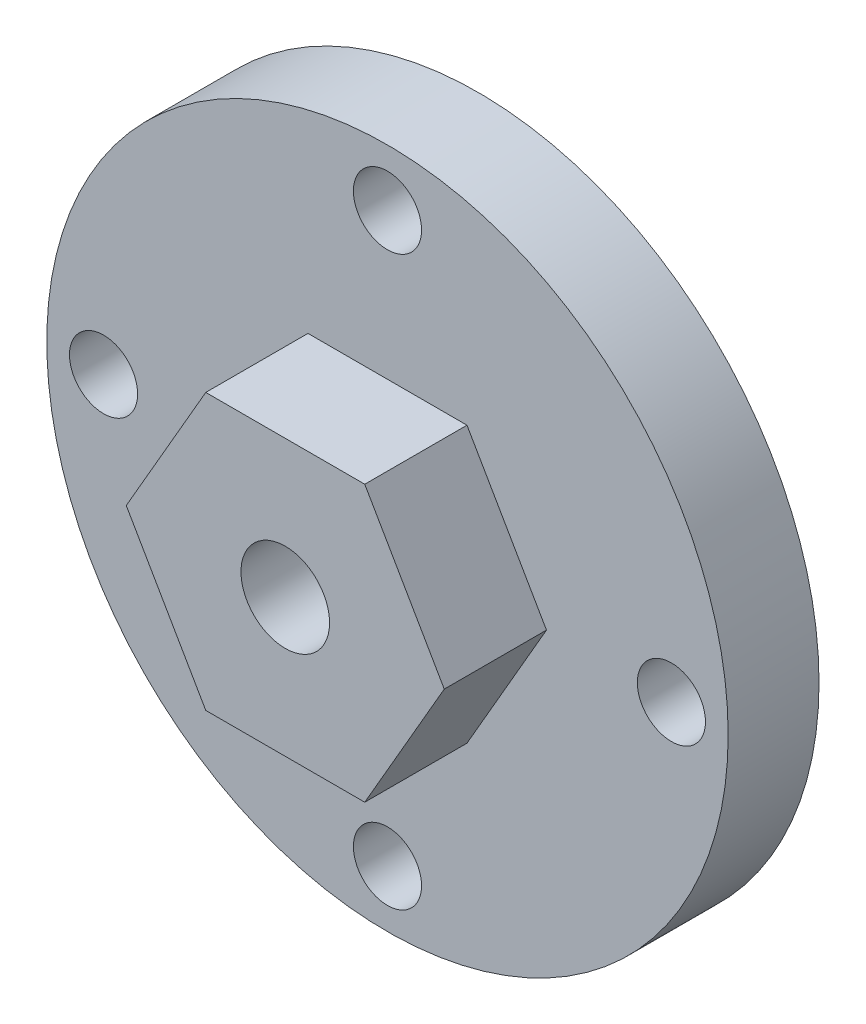
ISO-10303-21;
HEADER;
FILE_DESCRIPTION(('STEP AP214'),'2;1');
FILE_NAME('part.step','',(''),(''),'','','');
FILE_SCHEMA(('AUTOMOTIVE_DESIGN { 1 0 10303 214 1 1 1 1 }'));
ENDSEC;
DATA;
#1=APPLICATION_CONTEXT('core data for automotive mechanical design processes');
#2=APPLICATION_PROTOCOL_DEFINITION('international standard','automotive_design',2000,#1);
#3=PRODUCT_CONTEXT('',#1,'mechanical');
#4=PRODUCT('Part','Part','',(#3));
#5=PRODUCT_RELATED_PRODUCT_CATEGORY('part','',(#4));
#6=PRODUCT_DEFINITION_FORMATION('','',#4);
#7=PRODUCT_DEFINITION_CONTEXT('part definition',#1,'design');
#8=PRODUCT_DEFINITION('design','',#6,#7);
#9=PRODUCT_DEFINITION_SHAPE('','',#8);
#10=(LENGTH_UNIT() NAMED_UNIT(*) SI_UNIT(.MILLI.,.METRE.));
#11=(NAMED_UNIT(*) PLANE_ANGLE_UNIT() SI_UNIT($,.RADIAN.));
#12=(NAMED_UNIT(*) SI_UNIT($,.STERADIAN.) SOLID_ANGLE_UNIT());
#13=UNCERTAINTY_MEASURE_WITH_UNIT(LENGTH_MEASURE(1.E-05),#10,'distance_accuracy_value','');
#14=(GEOMETRIC_REPRESENTATION_CONTEXT(3) GLOBAL_UNCERTAINTY_ASSIGNED_CONTEXT((#13)) GLOBAL_UNIT_ASSIGNED_CONTEXT((#10,
#11,#12)) REPRESENTATION_CONTEXT('',''));
#15=CARTESIAN_POINT('',(0.,0.,0.));
#16=DIRECTION('',(0.,0.,1.));
#17=DIRECTION('',(1.,0.,0.));
#18=AXIS2_PLACEMENT_3D('',#15,#16,#17);
#19=CARTESIAN_POINT('',(0.,0.,4.));
#20=DIRECTION('',(0.,0.,-1.));
#21=DIRECTION('',(-1.,0.,0.));
#22=AXIS2_PLACEMENT_3D('',#19,#20,#21);
#23=CYLINDRICAL_SURFACE('',#22,15.);
#24=CARTESIAN_POINT('',(0.,0.,4.));
#25=DIRECTION('',(0.,0.,1.));
#26=DIRECTION('',(1.,0.,0.));
#27=AXIS2_PLACEMENT_3D('',#24,#25,#26);
#28=CIRCLE('',#27,15.);
#29=CARTESIAN_POINT('',(15.,0.,4.));
#30=VERTEX_POINT('',#29);
#31=EDGE_CURVE('E11',#30,#30,#28,.T.);
#32=ORIENTED_EDGE('',*,*,#31,.F.);
#33=EDGE_LOOP('',(#32));
#34=FACE_BOUND('',#33,.T.);
#35=CARTESIAN_POINT('',(0.,0.,0.));
#36=DIRECTION('',(0.,0.,1.));
#37=DIRECTION('',(1.,0.,0.));
#38=AXIS2_PLACEMENT_3D('',#35,#36,#37);
#39=CIRCLE('',#38,15.);
#40=CARTESIAN_POINT('',(15.,0.,0.));
#41=VERTEX_POINT('',#40);
#42=EDGE_CURVE('E37',#41,#41,#39,.T.);
#43=ORIENTED_EDGE('',*,*,#42,.T.);
#44=EDGE_LOOP('',(#43));
#45=FACE_BOUND('',#44,.T.);
#46=ADVANCED_FACE('F34',(#34,#45),#23,.T.);
#47=CARTESIAN_POINT('',(0.,0.,4.));
#48=DIRECTION('',(0.,0.,1.));
#49=DIRECTION('',(1.,0.,0.));
#50=AXIS2_PLACEMENT_3D('',#47,#48,#49);
#51=PLANE('',#50);
#52=CARTESIAN_POINT('',(0.,12.5,4.));
#53=DIRECTION('',(0.,0.,1.));
#54=DIRECTION('',(1.,0.,0.));
#55=AXIS2_PLACEMENT_3D('',#52,#53,#54);
#56=CIRCLE('',#55,1.5);
#57=CARTESIAN_POINT('',(1.5,12.5,4.));
#58=VERTEX_POINT('',#57);
#59=EDGE_CURVE('E143',#58,#58,#56,.T.);
#60=ORIENTED_EDGE('',*,*,#59,.F.);
#61=EDGE_LOOP('',(#60));
#62=FACE_BOUND('',#61,.T.);
#63=CARTESIAN_POINT('',(-12.5,0.,4.));
#64=DIRECTION('',(0.,0.,1.));
#65=DIRECTION('',(1.,0.,0.));
#66=AXIS2_PLACEMENT_3D('',#63,#64,#65);
#67=CIRCLE('',#66,1.5);
#68=CARTESIAN_POINT('',(-11.,0.,4.));
#69=VERTEX_POINT('',#68);
#70=EDGE_CURVE('E148',#69,#69,#67,.T.);
#71=ORIENTED_EDGE('',*,*,#70,.F.);
#72=EDGE_LOOP('',(#71));
#73=FACE_BOUND('',#72,.T.);
#74=CARTESIAN_POINT('',(-3.50678942383248E-13,-12.5,4.));
#75=DIRECTION('',(0.,0.,1.));
#76=DIRECTION('',(1.,0.,0.));
#77=AXIS2_PLACEMENT_3D('',#74,#75,#76);
#78=CIRCLE('',#77,1.50000000000042);
#79=CARTESIAN_POINT('',(1.50000000000007,-12.5,4.));
#80=VERTEX_POINT('',#79);
#81=EDGE_CURVE('E151',#80,#80,#78,.T.);
#82=ORIENTED_EDGE('',*,*,#81,.F.);
#83=EDGE_LOOP('',(#82));
#84=FACE_BOUND('',#83,.T.);
#85=CARTESIAN_POINT('',(12.4999999999998,-1.76870279690558E-13,4.));
#86=DIRECTION('',(0.,0.,1.));
#87=DIRECTION('',(1.,0.,0.));
#88=AXIS2_PLACEMENT_3D('',#85,#86,#87);
#89=CIRCLE('',#88,1.50000000000034);
#90=CARTESIAN_POINT('',(14.0000000000002,-1.76870279690558E-13,4.));
#91=VERTEX_POINT('',#90);
#92=EDGE_CURVE('E154',#91,#91,#89,.T.);
#93=ORIENTED_EDGE('',*,*,#92,.F.);
#94=EDGE_LOOP('',(#93));
#95=FACE_BOUND('',#94,.T.);
#96=DIRECTION('',(-0.500000000000001,0.866025403784438,0.));
#97=VECTOR('',#96,1.);
#98=CARTESIAN_POINT('',(7.00000000000001,0.,4.));
#99=LINE('',#98,#97);
#100=CARTESIAN_POINT('',(7.00000000000001,0.,4.));
#101=VERTEX_POINT('',#100);
#102=CARTESIAN_POINT('',(3.5,6.06217782649108,4.));
#103=VERTEX_POINT('',#102);
#104=EDGE_CURVE('E48',#101,#103,#99,.T.);
#105=ORIENTED_EDGE('',*,*,#104,.F.);
#106=DIRECTION('',(0.5,0.866025403784439,0.));
#107=VECTOR('',#106,1.);
#108=CARTESIAN_POINT('',(3.50000000000001,-6.06217782649107,4.));
#109=LINE('',#108,#107);
#110=CARTESIAN_POINT('',(3.50000000000001,-6.06217782649107,4.));
#111=VERTEX_POINT('',#110);
#112=EDGE_CURVE('E52',#111,#101,#109,.T.);
#113=ORIENTED_EDGE('',*,*,#112,.F.);
#114=DIRECTION('',(1.,0.,0.));
#115=VECTOR('',#114,1.);
#116=CARTESIAN_POINT('',(-3.5,-6.06217782649108,4.));
#117=LINE('',#116,#115);
#118=CARTESIAN_POINT('',(-3.5,-6.06217782649108,4.));
#119=VERTEX_POINT('',#118);
#120=EDGE_CURVE('E122',#119,#111,#117,.T.);
#121=ORIENTED_EDGE('',*,*,#120,.F.);
#122=DIRECTION('',(0.5,-0.866025403784439,0.));
#123=VECTOR('',#122,1.);
#124=CARTESIAN_POINT('',(-7.,0.,4.));
#125=LINE('',#124,#123);
#126=CARTESIAN_POINT('',(-7.,0.,4.));
#127=VERTEX_POINT('',#126);
#128=EDGE_CURVE('E124',#127,#119,#125,.T.);
#129=ORIENTED_EDGE('',*,*,#128,.F.);
#130=DIRECTION('',(-0.5,-0.866025403784439,0.));
#131=VECTOR('',#130,1.);
#132=CARTESIAN_POINT('',(-3.5,6.06217782649108,4.));
#133=LINE('',#132,#131);
#134=CARTESIAN_POINT('',(-3.5,6.06217782649108,4.));
#135=VERTEX_POINT('',#134);
#136=EDGE_CURVE('E127',#135,#127,#133,.T.);
#137=ORIENTED_EDGE('',*,*,#136,.F.);
#138=DIRECTION('',(-1.,0.,0.));
#139=VECTOR('',#138,1.);
#140=CARTESIAN_POINT('',(3.5,6.06217782649108,4.));
#141=LINE('',#140,#139);
#142=EDGE_CURVE('E130',#103,#135,#141,.T.);
#143=ORIENTED_EDGE('',*,*,#142,.F.);
#144=EDGE_LOOP('',(#105,#113,#121,#129,#137,#143));
#145=FACE_BOUND('',#144,.T.);
#146=ORIENTED_EDGE('',*,*,#31,.T.);
#147=EDGE_LOOP('',(#146));
#148=FACE_BOUND('',#147,.T.);
#149=ADVANCED_FACE('F175',(#62,#73,#84,#95,#145,#148),#51,.T.);
#150=CARTESIAN_POINT('',(0.,0.,0.));
#151=DIRECTION('',(0.,0.,1.));
#152=DIRECTION('',(1.,0.,0.));
#153=AXIS2_PLACEMENT_3D('',#150,#151,#152);
#154=PLANE('',#153);
#155=CARTESIAN_POINT('',(0.,12.5,0.));
#156=DIRECTION('',(0.,0.,-1.));
#157=DIRECTION('',(-1.,0.,0.));
#158=AXIS2_PLACEMENT_3D('',#155,#156,#157);
#159=CIRCLE('',#158,1.5);
#160=CARTESIAN_POINT('',(-1.5,12.5,0.));
#161=VERTEX_POINT('',#160);
#162=EDGE_CURVE('E157',#161,#161,#159,.T.);
#163=ORIENTED_EDGE('',*,*,#162,.F.);
#164=EDGE_LOOP('',(#163));
#165=FACE_BOUND('',#164,.T.);
#166=CARTESIAN_POINT('',(-12.5,0.,0.));
#167=DIRECTION('',(0.,0.,-1.));
#168=DIRECTION('',(-1.,0.,0.));
#169=AXIS2_PLACEMENT_3D('',#166,#167,#168);
#170=CIRCLE('',#169,1.5);
#171=CARTESIAN_POINT('',(-14.,0.,0.));
#172=VERTEX_POINT('',#171);
#173=EDGE_CURVE('E164',#172,#172,#170,.T.);
#174=ORIENTED_EDGE('',*,*,#173,.F.);
#175=EDGE_LOOP('',(#174));
#176=FACE_BOUND('',#175,.T.);
#177=CARTESIAN_POINT('',(-3.50678942383248E-13,-12.5,0.));
#178=DIRECTION('',(0.,0.,-1.));
#179=DIRECTION('',(-1.,0.,0.));
#180=AXIS2_PLACEMENT_3D('',#177,#178,#179);
#181=CIRCLE('',#180,1.50000000000042);
#182=CARTESIAN_POINT('',(-1.50000000000077,-12.5,0.));
#183=VERTEX_POINT('',#182);
#184=EDGE_CURVE('E161',#183,#183,#181,.T.);
#185=ORIENTED_EDGE('',*,*,#184,.F.);
#186=EDGE_LOOP('',(#185));
#187=FACE_BOUND('',#186,.T.);
#188=CARTESIAN_POINT('',(12.4999999999998,-1.76870279690558E-13,0.));
#189=DIRECTION('',(0.,0.,-1.));
#190=DIRECTION('',(-1.,0.,0.));
#191=AXIS2_PLACEMENT_3D('',#188,#189,#190);
#192=CIRCLE('',#191,1.50000000000034);
#193=CARTESIAN_POINT('',(10.9999999999995,-1.76870279690558E-13,0.));
#194=VERTEX_POINT('',#193);
#195=EDGE_CURVE('E158',#194,#194,#192,.T.);
#196=ORIENTED_EDGE('',*,*,#195,.F.);
#197=EDGE_LOOP('',(#196));
#198=FACE_BOUND('',#197,.T.);
#199=CARTESIAN_POINT('',(0.,0.,0.));
#200=DIRECTION('',(0.,0.,1.));
#201=DIRECTION('',(1.,0.,0.));
#202=AXIS2_PLACEMENT_3D('',#199,#200,#201);
#203=CIRCLE('',#202,1.95);
#204=CARTESIAN_POINT('',(1.95,0.,0.));
#205=VERTEX_POINT('',#204);
#206=EDGE_CURVE('E133',#205,#205,#203,.T.);
#207=ORIENTED_EDGE('',*,*,#206,.T.);
#208=EDGE_LOOP('',(#207));
#209=FACE_BOUND('',#208,.T.);
#210=ORIENTED_EDGE('',*,*,#42,.F.);
#211=EDGE_LOOP('',(#210));
#212=FACE_BOUND('',#211,.T.);
#213=ADVANCED_FACE('F172',(#165,#176,#187,#198,#209,#212),#154,.F.);
#214=CARTESIAN_POINT('',(7.00000000000001,0.,8.5));
#215=DIRECTION('',(-0.866025403784438,-0.500000000000001,0.));
#216=DIRECTION('',(0.500000000000001,-0.866025403784438,0.));
#217=AXIS2_PLACEMENT_3D('',#214,#215,#216);
#218=PLANE('',#217);
#219=ORIENTED_EDGE('',*,*,#104,.T.);
#220=DIRECTION('',(0.,0.,-1.));
#221=VECTOR('',#220,1.);
#222=CARTESIAN_POINT('',(3.5,6.06217782649108,8.5));
#223=LINE('',#222,#221);
#224=CARTESIAN_POINT('',(3.5,6.06217782649108,8.5));
#225=VERTEX_POINT('',#224);
#226=EDGE_CURVE('E89',#225,#103,#223,.T.);
#227=ORIENTED_EDGE('',*,*,#226,.F.);
#228=DIRECTION('',(-0.500000000000001,0.866025403784438,0.));
#229=VECTOR('',#228,1.);
#230=CARTESIAN_POINT('',(7.00000000000001,0.,8.5));
#231=LINE('',#230,#229);
#232=CARTESIAN_POINT('',(7.00000000000001,0.,8.5));
#233=VERTEX_POINT('',#232);
#234=EDGE_CURVE('E95',#233,#225,#231,.T.);
#235=ORIENTED_EDGE('',*,*,#234,.F.);
#236=DIRECTION('',(0.,0.,-1.));
#237=VECTOR('',#236,1.);
#238=CARTESIAN_POINT('',(7.00000000000001,0.,8.5));
#239=LINE('',#238,#237);
#240=EDGE_CURVE('E119',#233,#101,#239,.T.);
#241=ORIENTED_EDGE('',*,*,#240,.T.);
#242=EDGE_LOOP('',(#219,#227,#235,#241));
#243=FACE_BOUND('',#242,.T.);
#244=ADVANCED_FACE('F105',(#243),#218,.F.);
#245=CARTESIAN_POINT('',(3.5,6.06217782649108,8.5));
#246=DIRECTION('',(0.,-1.,0.));
#247=DIRECTION('',(0.,0.,-1.));
#248=AXIS2_PLACEMENT_3D('',#245,#246,#247);
#249=PLANE('',#248);
#250=ORIENTED_EDGE('',*,*,#142,.T.);
#251=DIRECTION('',(0.,0.,-1.));
#252=VECTOR('',#251,1.);
#253=CARTESIAN_POINT('',(-3.5,6.06217782649108,8.5));
#254=LINE('',#253,#252);
#255=CARTESIAN_POINT('',(-3.5,6.06217782649108,8.5));
#256=VERTEX_POINT('',#255);
#257=EDGE_CURVE('E91',#256,#135,#254,.T.);
#258=ORIENTED_EDGE('',*,*,#257,.F.);
#259=DIRECTION('',(-1.,0.,0.));
#260=VECTOR('',#259,1.);
#261=CARTESIAN_POINT('',(3.5,6.06217782649108,8.5));
#262=LINE('',#261,#260);
#263=EDGE_CURVE('E84',#225,#256,#262,.T.);
#264=ORIENTED_EDGE('',*,*,#263,.F.);
#265=ORIENTED_EDGE('',*,*,#226,.T.);
#266=EDGE_LOOP('',(#250,#258,#264,#265));
#267=FACE_BOUND('',#266,.T.);
#268=ADVANCED_FACE('F87',(#267),#249,.F.);
#269=CARTESIAN_POINT('',(-3.5,6.06217782649108,8.5));
#270=DIRECTION('',(0.866025403784438,-0.5,0.));
#271=DIRECTION('',(0.5,0.866025403784439,0.));
#272=AXIS2_PLACEMENT_3D('',#269,#270,#271);
#273=PLANE('',#272);
#274=ORIENTED_EDGE('',*,*,#136,.T.);
#275=DIRECTION('',(0.,0.,-1.));
#276=VECTOR('',#275,1.);
#277=CARTESIAN_POINT('',(-7.,0.,8.5));
#278=LINE('',#277,#276);
#279=CARTESIAN_POINT('',(-7.,0.,8.5));
#280=VERTEX_POINT('',#279);
#281=EDGE_CURVE('E108',#280,#127,#278,.T.);
#282=ORIENTED_EDGE('',*,*,#281,.F.);
#283=DIRECTION('',(-0.5,-0.866025403784439,0.));
#284=VECTOR('',#283,1.);
#285=CARTESIAN_POINT('',(-3.5,6.06217782649108,8.5));
#286=LINE('',#285,#284);
#287=EDGE_CURVE('E94',#256,#280,#286,.T.);
#288=ORIENTED_EDGE('',*,*,#287,.F.);
#289=ORIENTED_EDGE('',*,*,#257,.T.);
#290=EDGE_LOOP('',(#274,#282,#288,#289));
#291=FACE_BOUND('',#290,.T.);
#292=ADVANCED_FACE('F204',(#291),#273,.F.);
#293=CARTESIAN_POINT('',(-7.,0.,8.5));
#294=DIRECTION('',(0.866025403784439,0.5,0.));
#295=DIRECTION('',(-0.5,0.866025403784439,0.));
#296=AXIS2_PLACEMENT_3D('',#293,#294,#295);
#297=PLANE('',#296);
#298=ORIENTED_EDGE('',*,*,#128,.T.);
#299=DIRECTION('',(0.,0.,-1.));
#300=VECTOR('',#299,1.);
#301=CARTESIAN_POINT('',(-3.5,-6.06217782649108,8.5));
#302=LINE('',#301,#300);
#303=CARTESIAN_POINT('',(-3.5,-6.06217782649108,8.5));
#304=VERTEX_POINT('',#303);
#305=EDGE_CURVE('E113',#304,#119,#302,.T.);
#306=ORIENTED_EDGE('',*,*,#305,.F.);
#307=DIRECTION('',(0.5,-0.866025403784439,0.));
#308=VECTOR('',#307,1.);
#309=CARTESIAN_POINT('',(-7.,0.,8.5));
#310=LINE('',#309,#308);
#311=EDGE_CURVE('E137',#280,#304,#310,.T.);
#312=ORIENTED_EDGE('',*,*,#311,.F.);
#313=ORIENTED_EDGE('',*,*,#281,.T.);
#314=EDGE_LOOP('',(#298,#306,#312,#313));
#315=FACE_BOUND('',#314,.T.);
#316=ADVANCED_FACE('F207',(#315),#297,.F.);
#317=CARTESIAN_POINT('',(-3.5,-6.06217782649108,8.5));
#318=DIRECTION('',(0.,1.,0.));
#319=DIRECTION('',(-1.,0.,0.));
#320=AXIS2_PLACEMENT_3D('',#317,#318,#319);
#321=PLANE('',#320);
#322=ORIENTED_EDGE('',*,*,#120,.T.);
#323=DIRECTION('',(0.,0.,-1.));
#324=VECTOR('',#323,1.);
#325=CARTESIAN_POINT('',(3.50000000000001,-6.06217782649107,8.5));
#326=LINE('',#325,#324);
#327=CARTESIAN_POINT('',(3.50000000000001,-6.06217782649107,8.5));
#328=VERTEX_POINT('',#327);
#329=EDGE_CURVE('E116',#328,#111,#326,.T.);
#330=ORIENTED_EDGE('',*,*,#329,.F.);
#331=DIRECTION('',(1.,0.,0.));
#332=VECTOR('',#331,1.);
#333=CARTESIAN_POINT('',(-3.5,-6.06217782649108,8.5));
#334=LINE('',#333,#332);
#335=EDGE_CURVE('E135',#304,#328,#334,.T.);
#336=ORIENTED_EDGE('',*,*,#335,.F.);
#337=ORIENTED_EDGE('',*,*,#305,.T.);
#338=EDGE_LOOP('',(#322,#330,#336,#337));
#339=FACE_BOUND('',#338,.T.);
#340=ADVANCED_FACE('F211',(#339),#321,.F.);
#341=CARTESIAN_POINT('',(3.50000000000001,-6.06217782649107,8.5));
#342=DIRECTION('',(-0.866025403784439,0.5,0.));
#343=DIRECTION('',(-0.5,-0.866025403784439,0.));
#344=AXIS2_PLACEMENT_3D('',#341,#342,#343);
#345=PLANE('',#344);
#346=ORIENTED_EDGE('',*,*,#112,.T.);
#347=ORIENTED_EDGE('',*,*,#240,.F.);
#348=DIRECTION('',(0.5,0.866025403784439,0.));
#349=VECTOR('',#348,1.);
#350=CARTESIAN_POINT('',(3.50000000000001,-6.06217782649107,8.5));
#351=LINE('',#350,#349);
#352=EDGE_CURVE('E100',#328,#233,#351,.T.);
#353=ORIENTED_EDGE('',*,*,#352,.F.);
#354=ORIENTED_EDGE('',*,*,#329,.T.);
#355=EDGE_LOOP('',(#346,#347,#353,#354));
#356=FACE_BOUND('',#355,.T.);
#357=ADVANCED_FACE('F215',(#356),#345,.F.);
#358=CARTESIAN_POINT('',(0.,0.,8.5));
#359=DIRECTION('',(0.,0.,1.));
#360=DIRECTION('',(1.,0.,0.));
#361=AXIS2_PLACEMENT_3D('',#358,#359,#360);
#362=PLANE('',#361);
#363=CARTESIAN_POINT('',(0.,0.,8.5));
#364=DIRECTION('',(0.,0.,1.));
#365=DIRECTION('',(1.,0.,0.));
#366=AXIS2_PLACEMENT_3D('',#363,#364,#365);
#367=CIRCLE('',#366,1.95);
#368=CARTESIAN_POINT('',(1.95,0.,8.5));
#369=VERTEX_POINT('',#368);
#370=EDGE_CURVE('E140',#369,#369,#367,.T.);
#371=ORIENTED_EDGE('',*,*,#370,.F.);
#372=EDGE_LOOP('',(#371));
#373=FACE_BOUND('',#372,.T.);
#374=ORIENTED_EDGE('',*,*,#234,.T.);
#375=ORIENTED_EDGE('',*,*,#263,.T.);
#376=ORIENTED_EDGE('',*,*,#287,.T.);
#377=ORIENTED_EDGE('',*,*,#311,.T.);
#378=ORIENTED_EDGE('',*,*,#335,.T.);
#379=ORIENTED_EDGE('',*,*,#352,.T.);
#380=EDGE_LOOP('',(#374,#375,#376,#377,#378,#379));
#381=FACE_BOUND('',#380,.T.);
#382=ADVANCED_FACE('F98',(#373,#381),#362,.T.);
#383=CARTESIAN_POINT('',(0.,0.,0.));
#384=DIRECTION('',(0.,0.,1.));
#385=DIRECTION('',(1.,0.,0.));
#386=AXIS2_PLACEMENT_3D('',#383,#384,#385);
#387=CYLINDRICAL_SURFACE('',#386,1.95);
#388=ORIENTED_EDGE('',*,*,#206,.F.);
#389=EDGE_LOOP('',(#388));
#390=FACE_BOUND('',#389,.T.);
#391=ORIENTED_EDGE('',*,*,#370,.T.);
#392=EDGE_LOOP('',(#391));
#393=FACE_BOUND('',#392,.T.);
#394=ADVANCED_FACE('F222',(#390,#393),#387,.F.);
#395=CARTESIAN_POINT('',(12.4999999999998,-1.76870279690558E-13,8.5));
#396=DIRECTION('',(0.,0.,-1.));
#397=DIRECTION('',(-1.,0.,0.));
#398=AXIS2_PLACEMENT_3D('',#395,#396,#397);
#399=CYLINDRICAL_SURFACE('',#398,1.50000000000034);
#400=ORIENTED_EDGE('',*,*,#92,.T.);
#401=EDGE_LOOP('',(#400));
#402=FACE_BOUND('',#401,.T.);
#403=ORIENTED_EDGE('',*,*,#195,.T.);
#404=EDGE_LOOP('',(#403));
#405=FACE_BOUND('',#404,.T.);
#406=ADVANCED_FACE('F226',(#402,#405),#399,.F.);
#407=CARTESIAN_POINT('',(-3.50678942383248E-13,-12.5,8.5));
#408=DIRECTION('',(0.,0.,-1.));
#409=DIRECTION('',(-1.,0.,0.));
#410=AXIS2_PLACEMENT_3D('',#407,#408,#409);
#411=CYLINDRICAL_SURFACE('',#410,1.50000000000042);
#412=ORIENTED_EDGE('',*,*,#81,.T.);
#413=EDGE_LOOP('',(#412));
#414=FACE_BOUND('',#413,.T.);
#415=ORIENTED_EDGE('',*,*,#184,.T.);
#416=EDGE_LOOP('',(#415));
#417=FACE_BOUND('',#416,.T.);
#418=ADVANCED_FACE('F230',(#414,#417),#411,.F.);
#419=CARTESIAN_POINT('',(-12.5,0.,8.5));
#420=DIRECTION('',(0.,0.,-1.));
#421=DIRECTION('',(-1.,0.,0.));
#422=AXIS2_PLACEMENT_3D('',#419,#420,#421);
#423=CYLINDRICAL_SURFACE('',#422,1.5);
#424=ORIENTED_EDGE('',*,*,#70,.T.);
#425=EDGE_LOOP('',(#424));
#426=FACE_BOUND('',#425,.T.);
#427=ORIENTED_EDGE('',*,*,#173,.T.);
#428=EDGE_LOOP('',(#427));
#429=FACE_BOUND('',#428,.T.);
#430=ADVANCED_FACE('F234',(#426,#429),#423,.F.);
#431=CARTESIAN_POINT('',(0.,12.5,8.5));
#432=DIRECTION('',(0.,0.,-1.));
#433=DIRECTION('',(-1.,0.,0.));
#434=AXIS2_PLACEMENT_3D('',#431,#432,#433);
#435=CYLINDRICAL_SURFACE('',#434,1.5);
#436=ORIENTED_EDGE('',*,*,#59,.T.);
#437=EDGE_LOOP('',(#436));
#438=FACE_BOUND('',#437,.T.);
#439=ORIENTED_EDGE('',*,*,#162,.T.);
#440=EDGE_LOOP('',(#439));
#441=FACE_BOUND('',#440,.T.);
#442=ADVANCED_FACE('F170',(#438,#441),#435,.F.);
#443=CLOSED_SHELL('',(#46,#149,#213,#244,#268,#292,#316,#340,#357,#382,#394,#406,#418,#430,#442));
#444=MANIFOLD_SOLID_BREP('B2',#443);
#445=ADVANCED_BREP_SHAPE_REPRESENTATION('',(#18,#444),#14);
#446=SHAPE_DEFINITION_REPRESENTATION(#9,#445);
ENDSEC;
END-ISO-10303-21;
